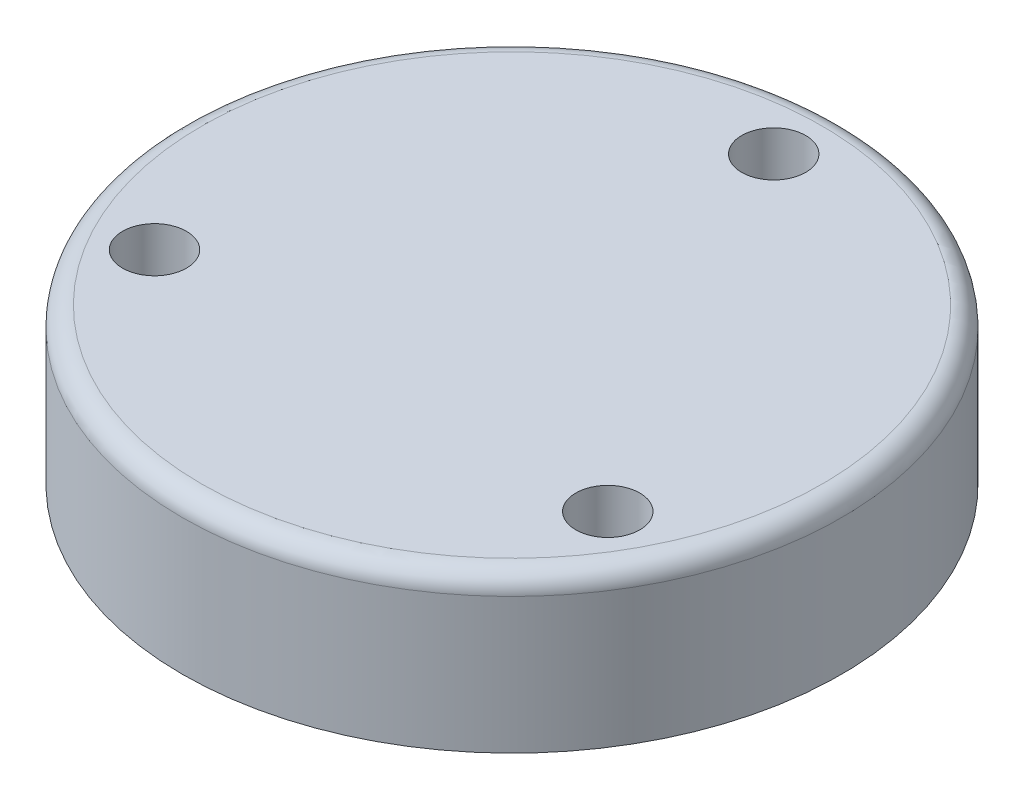
ISO-10303-21;
HEADER;
FILE_DESCRIPTION(('STEP AP214'),'2;1');
FILE_NAME('part.step','',(''),(''),'','','');
FILE_SCHEMA(('AUTOMOTIVE_DESIGN { 1 0 10303 214 1 1 1 1 }'));
ENDSEC;
DATA;
#1=APPLICATION_CONTEXT('core data for automotive mechanical design processes');
#2=APPLICATION_PROTOCOL_DEFINITION('international standard','automotive_design',2000,#1);
#3=PRODUCT_CONTEXT('',#1,'mechanical');
#4=PRODUCT('Part','Part','',(#3));
#5=PRODUCT_RELATED_PRODUCT_CATEGORY('part','',(#4));
#6=PRODUCT_DEFINITION_FORMATION('','',#4);
#7=PRODUCT_DEFINITION_CONTEXT('part definition',#1,'design');
#8=PRODUCT_DEFINITION('design','',#6,#7);
#9=PRODUCT_DEFINITION_SHAPE('','',#8);
#10=(LENGTH_UNIT() NAMED_UNIT(*) SI_UNIT(.MILLI.,.METRE.));
#11=(NAMED_UNIT(*) PLANE_ANGLE_UNIT() SI_UNIT($,.RADIAN.));
#12=(NAMED_UNIT(*) SI_UNIT($,.STERADIAN.) SOLID_ANGLE_UNIT());
#13=UNCERTAINTY_MEASURE_WITH_UNIT(LENGTH_MEASURE(1.E-05),#10,'distance_accuracy_value','');
#14=(GEOMETRIC_REPRESENTATION_CONTEXT(3) GLOBAL_UNCERTAINTY_ASSIGNED_CONTEXT((#13)) GLOBAL_UNIT_ASSIGNED_CONTEXT((#10,
#11,#12)) REPRESENTATION_CONTEXT('',''));
#15=CARTESIAN_POINT('',(0.,0.,0.));
#16=DIRECTION('',(0.,0.,1.));
#17=DIRECTION('',(1.,0.,0.));
#18=AXIS2_PLACEMENT_3D('',#15,#16,#17);
#19=CARTESIAN_POINT('',(0.,8.,0.));
#20=DIRECTION('',(0.,-1.,0.));
#21=DIRECTION('',(0.,0.,-1.));
#22=AXIS2_PLACEMENT_3D('',#19,#20,#21);
#23=CYLINDRICAL_SURFACE('',#22,17.);
#24=CARTESIAN_POINT('',(0.,7.,0.));
#25=DIRECTION('',(0.,1.,0.));
#26=DIRECTION('',(0.,0.,1.));
#27=AXIS2_PLACEMENT_3D('',#24,#25,#26);
#28=CIRCLE('',#27,17.);
#29=CARTESIAN_POINT('',(0.,7.,17.));
#30=VERTEX_POINT('',#29);
#31=EDGE_CURVE('E10',#30,#30,#28,.F.);
#32=ORIENTED_EDGE('',*,*,#31,.T.);
#33=EDGE_LOOP('',(#32));
#34=FACE_BOUND('',#33,.T.);
#35=CARTESIAN_POINT('',(0.,0.,0.));
#36=DIRECTION('',(0.,1.,0.));
#37=DIRECTION('',(0.,0.,1.));
#38=AXIS2_PLACEMENT_3D('',#35,#36,#37);
#39=CIRCLE('',#38,17.);
#40=CARTESIAN_POINT('',(0.,0.,17.));
#41=VERTEX_POINT('',#40);
#42=EDGE_CURVE('E50',#41,#41,#39,.T.);
#43=ORIENTED_EDGE('',*,*,#42,.T.);
#44=EDGE_LOOP('',(#43));
#45=FACE_BOUND('',#44,.T.);
#46=ADVANCED_FACE('F37',(#34,#45),#23,.T.);
#47=CARTESIAN_POINT('',(0.,8.,0.));
#48=DIRECTION('',(0.,1.,0.));
#49=DIRECTION('',(0.,0.,1.));
#50=AXIS2_PLACEMENT_3D('',#47,#48,#49);
#51=PLANE('',#50);
#52=CARTESIAN_POINT('',(0.,8.,0.));
#53=DIRECTION('',(0.,1.,0.));
#54=DIRECTION('',(0.,0.,1.));
#55=AXIS2_PLACEMENT_3D('',#52,#53,#54);
#56=CIRCLE('',#55,16.);
#57=CARTESIAN_POINT('',(0.,8.,16.));
#58=VERTEX_POINT('',#57);
#59=EDGE_CURVE('E45',#58,#58,#56,.T.);
#60=ORIENTED_EDGE('',*,*,#59,.T.);
#61=EDGE_LOOP('',(#60));
#62=FACE_BOUND('',#61,.T.);
#63=CARTESIAN_POINT('',(0.,8.,-13.5));
#64=DIRECTION('',(0.,1.,0.));
#65=DIRECTION('',(0.,0.,1.));
#66=AXIS2_PLACEMENT_3D('',#63,#64,#65);
#67=CIRCLE('',#66,1.65);
#68=CARTESIAN_POINT('',(0.,8.,-11.85));
#69=VERTEX_POINT('',#68);
#70=EDGE_CURVE('E68',#69,#69,#67,.T.);
#71=ORIENTED_EDGE('',*,*,#70,.F.);
#72=EDGE_LOOP('',(#71));
#73=FACE_BOUND('',#72,.T.);
#74=CARTESIAN_POINT('',(11.6913429510908,8.,6.7499999999995));
#75=DIRECTION('',(0.,1.,0.));
#76=DIRECTION('',(0.,0.,1.));
#77=AXIS2_PLACEMENT_3D('',#74,#75,#76);
#78=CIRCLE('',#77,1.65);
#79=CARTESIAN_POINT('',(11.6913429510908,8.,8.3999999999995));
#80=VERTEX_POINT('',#79);
#81=EDGE_CURVE('E74',#80,#80,#78,.T.);
#82=ORIENTED_EDGE('',*,*,#81,.F.);
#83=EDGE_LOOP('',(#82));
#84=FACE_BOUND('',#83,.T.);
#85=CARTESIAN_POINT('',(-11.6913429510891,8.,6.7500000000005));
#86=DIRECTION('',(0.,1.,0.));
#87=DIRECTION('',(0.,0.,1.));
#88=AXIS2_PLACEMENT_3D('',#85,#86,#87);
#89=CIRCLE('',#88,1.65);
#90=CARTESIAN_POINT('',(-11.6913429510891,8.,8.4000000000005));
#91=VERTEX_POINT('',#90);
#92=EDGE_CURVE('E70',#91,#91,#89,.T.);
#93=ORIENTED_EDGE('',*,*,#92,.F.);
#94=EDGE_LOOP('',(#93));
#95=FACE_BOUND('',#94,.T.);
#96=ADVANCED_FACE('F85',(#62,#73,#84,#95),#51,.T.);
#97=CARTESIAN_POINT('',(0.,0.,0.));
#98=DIRECTION('',(0.,1.,0.));
#99=DIRECTION('',(0.,0.,1.));
#100=AXIS2_PLACEMENT_3D('',#97,#98,#99);
#101=PLANE('',#100);
#102=CARTESIAN_POINT('',(0.,0.,-13.5));
#103=DIRECTION('',(0.,1.,0.));
#104=DIRECTION('',(0.,0.,1.));
#105=AXIS2_PLACEMENT_3D('',#102,#103,#104);
#106=CIRCLE('',#105,1.65);
#107=CARTESIAN_POINT('',(0.,0.,-11.85));
#108=VERTEX_POINT('',#107);
#109=EDGE_CURVE('E55',#108,#108,#106,.T.);
#110=ORIENTED_EDGE('',*,*,#109,.T.);
#111=EDGE_LOOP('',(#110));
#112=FACE_BOUND('',#111,.T.);
#113=CARTESIAN_POINT('',(11.6913429510908,0.,6.7499999999995));
#114=DIRECTION('',(0.,1.,0.));
#115=DIRECTION('',(0.,0.,1.));
#116=AXIS2_PLACEMENT_3D('',#113,#114,#115);
#117=CIRCLE('',#116,1.65);
#118=CARTESIAN_POINT('',(11.6913429510908,0.,8.3999999999995));
#119=VERTEX_POINT('',#118);
#120=EDGE_CURVE('E61',#119,#119,#117,.T.);
#121=ORIENTED_EDGE('',*,*,#120,.T.);
#122=EDGE_LOOP('',(#121));
#123=FACE_BOUND('',#122,.T.);
#124=CARTESIAN_POINT('',(-11.6913429510891,0.,6.7500000000005));
#125=DIRECTION('',(0.,1.,0.));
#126=DIRECTION('',(0.,0.,1.));
#127=AXIS2_PLACEMENT_3D('',#124,#125,#126);
#128=CIRCLE('',#127,1.65);
#129=CARTESIAN_POINT('',(-11.6913429510891,0.,8.4000000000005));
#130=VERTEX_POINT('',#129);
#131=EDGE_CURVE('E65',#130,#130,#128,.T.);
#132=ORIENTED_EDGE('',*,*,#131,.T.);
#133=EDGE_LOOP('',(#132));
#134=FACE_BOUND('',#133,.T.);
#135=ORIENTED_EDGE('',*,*,#42,.F.);
#136=EDGE_LOOP('',(#135));
#137=FACE_BOUND('',#136,.T.);
#138=ADVANCED_FACE('F88',(#112,#123,#134,#137),#101,.F.);
#139=CARTESIAN_POINT('',(-11.6913429510891,-12.,6.7500000000005));
#140=DIRECTION('',(0.,1.,0.));
#141=DIRECTION('',(0.,0.,1.));
#142=AXIS2_PLACEMENT_3D('',#139,#140,#141);
#143=CYLINDRICAL_SURFACE('',#142,1.65);
#144=ORIENTED_EDGE('',*,*,#92,.T.);
#145=EDGE_LOOP('',(#144));
#146=FACE_BOUND('',#145,.T.);
#147=ORIENTED_EDGE('',*,*,#131,.F.);
#148=EDGE_LOOP('',(#147));
#149=FACE_BOUND('',#148,.T.);
#150=ADVANCED_FACE('F94',(#146,#149),#143,.F.);
#151=CARTESIAN_POINT('',(11.6913429510908,-12.,6.7499999999995));
#152=DIRECTION('',(0.,1.,0.));
#153=DIRECTION('',(0.,0.,1.));
#154=AXIS2_PLACEMENT_3D('',#151,#152,#153);
#155=CYLINDRICAL_SURFACE('',#154,1.65);
#156=ORIENTED_EDGE('',*,*,#81,.T.);
#157=EDGE_LOOP('',(#156));
#158=FACE_BOUND('',#157,.T.);
#159=ORIENTED_EDGE('',*,*,#120,.F.);
#160=EDGE_LOOP('',(#159));
#161=FACE_BOUND('',#160,.T.);
#162=ADVANCED_FACE('F97',(#158,#161),#155,.F.);
#163=CARTESIAN_POINT('',(0.,-12.,-13.5));
#164=DIRECTION('',(0.,1.,0.));
#165=DIRECTION('',(0.,0.,1.));
#166=AXIS2_PLACEMENT_3D('',#163,#164,#165);
#167=CYLINDRICAL_SURFACE('',#166,1.65);
#168=ORIENTED_EDGE('',*,*,#70,.T.);
#169=EDGE_LOOP('',(#168));
#170=FACE_BOUND('',#169,.T.);
#171=ORIENTED_EDGE('',*,*,#109,.F.);
#172=EDGE_LOOP('',(#171));
#173=FACE_BOUND('',#172,.T.);
#174=ADVANCED_FACE('F82',(#170,#173),#167,.F.);
#175=CARTESIAN_POINT('',(0.,7.,0.));
#176=DIRECTION('',(0.,1.,0.));
#177=DIRECTION('',(0.,0.,1.));
#178=AXIS2_PLACEMENT_3D('',#175,#176,#177);
#179=TOROIDAL_SURFACE('',#178,16.,1.);
#180=ORIENTED_EDGE('',*,*,#31,.F.);
#181=EDGE_LOOP('',(#180));
#182=FACE_BOUND('',#181,.T.);
#183=ORIENTED_EDGE('',*,*,#59,.F.);
#184=EDGE_LOOP('',(#183));
#185=FACE_BOUND('',#184,.T.);
#186=ADVANCED_FACE('F39',(#182,#185),#179,.T.);
#187=CLOSED_SHELL('',(#46,#96,#138,#150,#162,#174,#186));
#188=MANIFOLD_SOLID_BREP('B2',#187);
#189=ADVANCED_BREP_SHAPE_REPRESENTATION('',(#18,#188),#14);
#190=SHAPE_DEFINITION_REPRESENTATION(#9,#189);
ENDSEC;
END-ISO-10303-21;
